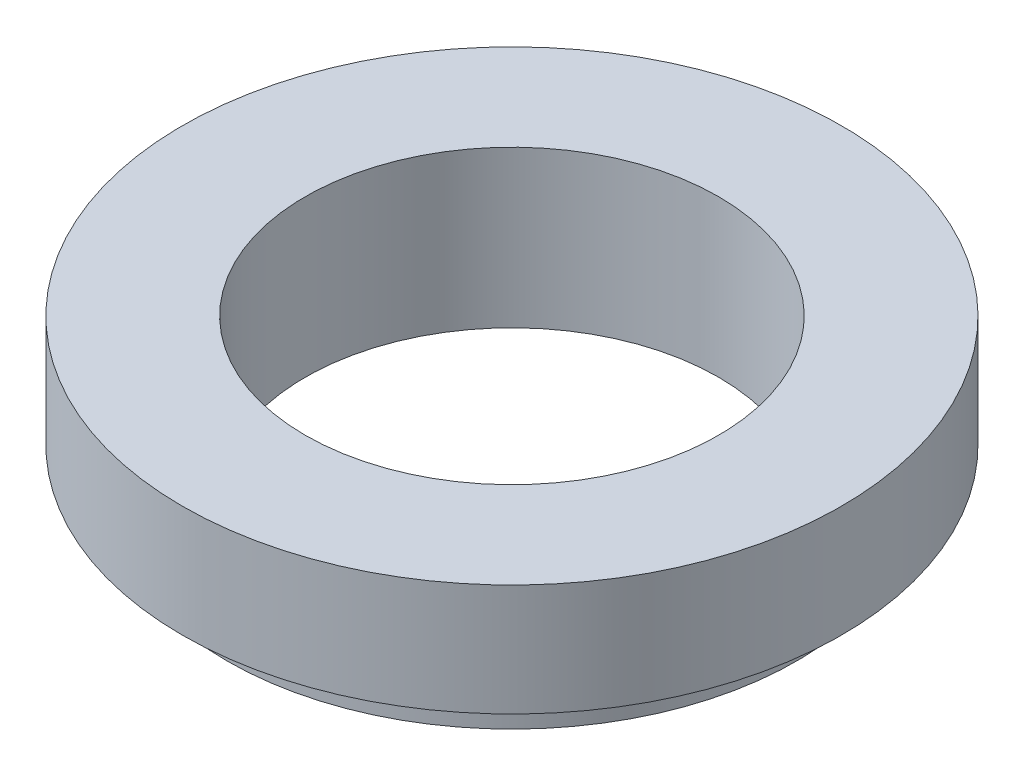
ISO-10303-21;
HEADER;
FILE_DESCRIPTION(('STEP AP214'),'2;1');
FILE_NAME('part.step','',(''),(''),'','','');
FILE_SCHEMA(('AUTOMOTIVE_DESIGN { 1 0 10303 214 1 1 1 1 }'));
ENDSEC;
DATA;
#1=APPLICATION_CONTEXT('core data for automotive mechanical design processes');
#2=APPLICATION_PROTOCOL_DEFINITION('international standard','automotive_design',2000,#1);
#3=PRODUCT_CONTEXT('',#1,'mechanical');
#4=PRODUCT('Part','Part','',(#3));
#5=PRODUCT_RELATED_PRODUCT_CATEGORY('part','',(#4));
#6=PRODUCT_DEFINITION_FORMATION('','',#4);
#7=PRODUCT_DEFINITION_CONTEXT('part definition',#1,'design');
#8=PRODUCT_DEFINITION('design','',#6,#7);
#9=PRODUCT_DEFINITION_SHAPE('','',#8);
#10=(LENGTH_UNIT() NAMED_UNIT(*) SI_UNIT(.MILLI.,.METRE.));
#11=(NAMED_UNIT(*) PLANE_ANGLE_UNIT() SI_UNIT($,.RADIAN.));
#12=(NAMED_UNIT(*) SI_UNIT($,.STERADIAN.) SOLID_ANGLE_UNIT());
#13=UNCERTAINTY_MEASURE_WITH_UNIT(LENGTH_MEASURE(1.E-05),#10,'distance_accuracy_value','');
#14=(GEOMETRIC_REPRESENTATION_CONTEXT(3) GLOBAL_UNCERTAINTY_ASSIGNED_CONTEXT((#13)) GLOBAL_UNIT_ASSIGNED_CONTEXT((#10,
#11,#12)) REPRESENTATION_CONTEXT('',''));
#15=CARTESIAN_POINT('',(0.,0.,0.));
#16=DIRECTION('',(0.,0.,1.));
#17=DIRECTION('',(1.,0.,0.));
#18=AXIS2_PLACEMENT_3D('',#15,#16,#17);
#19=CARTESIAN_POINT('',(29.5000000000003,0.,0.));
#20=DIRECTION('',(0.,-1.,0.));
#21=DIRECTION('',(0.,0.,-1.00000000000001));
#22=AXIS2_PLACEMENT_3D('',#19,#20,#21);
#23=PLANE('',#22);
#24=CARTESIAN_POINT('',(0.,0.,0.));
#25=DIRECTION('',(0.,1.,0.));
#26=DIRECTION('',(0.,0.,1.00000000000001));
#27=AXIS2_PLACEMENT_3D('',#24,#25,#26);
#28=CIRCLE('',#27,18.5);
#29=CARTESIAN_POINT('',(0.,0.,18.5000000000002));
#30=VERTEX_POINT('',#29);
#31=EDGE_CURVE('E10',#30,#30,#28,.T.);
#32=ORIENTED_EDGE('',*,*,#31,.F.);
#33=EDGE_LOOP('',(#32));
#34=FACE_BOUND('',#33,.T.);
#35=CARTESIAN_POINT('',(0.,0.,0.));
#36=DIRECTION('',(0.,1.,0.));
#37=DIRECTION('',(0.,0.,1.00000000000001));
#38=AXIS2_PLACEMENT_3D('',#35,#36,#37);
#39=CIRCLE('',#38,29.5);
#40=CARTESIAN_POINT('',(0.,0.,29.5000000000003));
#41=VERTEX_POINT('',#40);
#42=EDGE_CURVE('E52',#41,#41,#39,.T.);
#43=ORIENTED_EDGE('',*,*,#42,.T.);
#44=EDGE_LOOP('',(#43));
#45=FACE_BOUND('',#44,.T.);
#46=ADVANCED_FACE('F30',(#34,#45),#23,.F.);
#47=CARTESIAN_POINT('',(0.,0.,0.));
#48=DIRECTION('',(0.,1.,0.));
#49=DIRECTION('',(0.,0.,1.00000000000001));
#50=AXIS2_PLACEMENT_3D('',#47,#48,#49);
#51=CYLINDRICAL_SURFACE('',#50,18.5);
#52=CARTESIAN_POINT('',(0.,-14.,0.));
#53=DIRECTION('',(0.,1.,0.));
#54=DIRECTION('',(0.,0.,1.00000000000001));
#55=AXIS2_PLACEMENT_3D('',#52,#53,#54);
#56=CIRCLE('',#55,18.5);
#57=CARTESIAN_POINT('',(0.,-14.,18.5000000000002));
#58=VERTEX_POINT('',#57);
#59=EDGE_CURVE('E36',#58,#58,#56,.T.);
#60=ORIENTED_EDGE('',*,*,#59,.F.);
#61=EDGE_LOOP('',(#60));
#62=FACE_BOUND('',#61,.T.);
#63=ORIENTED_EDGE('',*,*,#31,.T.);
#64=EDGE_LOOP('',(#63));
#65=FACE_BOUND('',#64,.T.);
#66=ADVANCED_FACE('F77',(#62,#65),#51,.F.);
#67=CARTESIAN_POINT('',(18.5000000000001,-14.,0.));
#68=DIRECTION('',(0.,1.,0.));
#69=DIRECTION('',(0.,0.,1.00000000000001));
#70=AXIS2_PLACEMENT_3D('',#67,#68,#69);
#71=PLANE('',#70);
#72=CARTESIAN_POINT('',(0.,-14.,0.));
#73=DIRECTION('',(0.,1.,0.));
#74=DIRECTION('',(0.,0.,1.00000000000001));
#75=AXIS2_PLACEMENT_3D('',#72,#73,#74);
#76=CIRCLE('',#75,25.5);
#77=CARTESIAN_POINT('',(0.,-14.,25.5000000000003));
#78=VERTEX_POINT('',#77);
#79=EDGE_CURVE('E40',#78,#78,#76,.T.);
#80=ORIENTED_EDGE('',*,*,#79,.F.);
#81=EDGE_LOOP('',(#80));
#82=FACE_BOUND('',#81,.T.);
#83=ORIENTED_EDGE('',*,*,#59,.T.);
#84=EDGE_LOOP('',(#83));
#85=FACE_BOUND('',#84,.T.);
#86=ADVANCED_FACE('F72',(#82,#85),#71,.F.);
#87=CARTESIAN_POINT('',(0.,0.,0.));
#88=DIRECTION('',(0.,1.,0.));
#89=DIRECTION('',(0.,0.,1.00000000000001));
#90=AXIS2_PLACEMENT_3D('',#87,#88,#89);
#91=CYLINDRICAL_SURFACE('',#90,25.5);
#92=CARTESIAN_POINT('',(0.,-9.99999999999999,0.));
#93=DIRECTION('',(0.,1.,0.));
#94=DIRECTION('',(0.,0.,1.00000000000001));
#95=AXIS2_PLACEMENT_3D('',#92,#93,#94);
#96=CIRCLE('',#95,25.5);
#97=CARTESIAN_POINT('',(0.,-9.99999999999999,25.5000000000003));
#98=VERTEX_POINT('',#97);
#99=EDGE_CURVE('E44',#98,#98,#96,.T.);
#100=ORIENTED_EDGE('',*,*,#99,.F.);
#101=EDGE_LOOP('',(#100));
#102=FACE_BOUND('',#101,.T.);
#103=ORIENTED_EDGE('',*,*,#79,.T.);
#104=EDGE_LOOP('',(#103));
#105=FACE_BOUND('',#104,.T.);
#106=ADVANCED_FACE('F66',(#102,#105),#91,.T.);
#107=CARTESIAN_POINT('',(25.5000000000003,-9.99999999999999,0.));
#108=DIRECTION('',(0.,1.,0.));
#109=DIRECTION('',(0.,0.,1.00000000000001));
#110=AXIS2_PLACEMENT_3D('',#107,#108,#109);
#111=PLANE('',#110);
#112=CARTESIAN_POINT('',(0.,-9.99999999999999,0.));
#113=DIRECTION('',(0.,1.,0.));
#114=DIRECTION('',(0.,0.,1.00000000000001));
#115=AXIS2_PLACEMENT_3D('',#112,#113,#114);
#116=CIRCLE('',#115,29.5);
#117=CARTESIAN_POINT('',(0.,-9.99999999999999,29.5000000000003));
#118=VERTEX_POINT('',#117);
#119=EDGE_CURVE('E49',#118,#118,#116,.T.);
#120=ORIENTED_EDGE('',*,*,#119,.F.);
#121=EDGE_LOOP('',(#120));
#122=FACE_BOUND('',#121,.T.);
#123=ORIENTED_EDGE('',*,*,#99,.T.);
#124=EDGE_LOOP('',(#123));
#125=FACE_BOUND('',#124,.T.);
#126=ADVANCED_FACE('F60',(#122,#125),#111,.F.);
#127=CARTESIAN_POINT('',(0.,0.,0.));
#128=DIRECTION('',(0.,1.,0.));
#129=DIRECTION('',(0.,0.,1.00000000000001));
#130=AXIS2_PLACEMENT_3D('',#127,#128,#129);
#131=CYLINDRICAL_SURFACE('',#130,29.5);
#132=ORIENTED_EDGE('',*,*,#42,.F.);
#133=EDGE_LOOP('',(#132));
#134=FACE_BOUND('',#133,.T.);
#135=ORIENTED_EDGE('',*,*,#119,.T.);
#136=EDGE_LOOP('',(#135));
#137=FACE_BOUND('',#136,.T.);
#138=ADVANCED_FACE('F57',(#134,#137),#131,.T.);
#139=CLOSED_SHELL('',(#46,#66,#86,#106,#126,#138));
#140=MANIFOLD_SOLID_BREP('B2',#139);
#141=ADVANCED_BREP_SHAPE_REPRESENTATION('',(#18,#140),#14);
#142=SHAPE_DEFINITION_REPRESENTATION(#9,#141);
ENDSEC;
END-ISO-10303-21;
